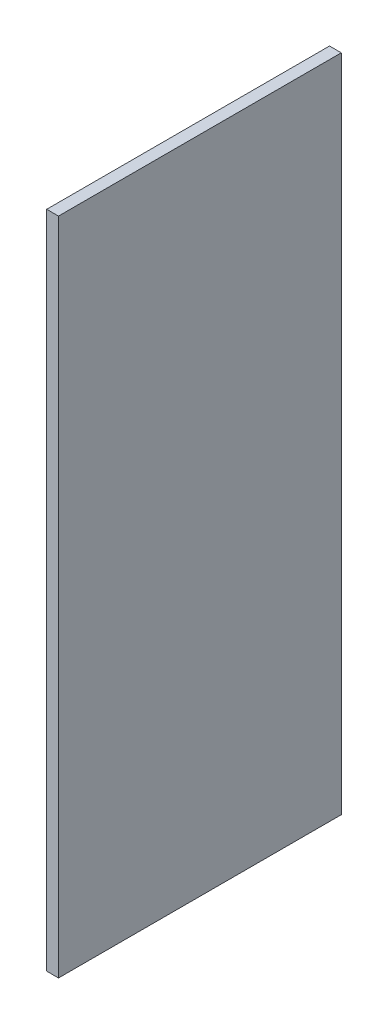
ISO-10303-21;
HEADER;
FILE_DESCRIPTION(('STEP AP214'),'2;1');
FILE_NAME('part.step','',(''),(''),'','','');
FILE_SCHEMA(('AUTOMOTIVE_DESIGN { 1 0 10303 214 1 1 1 1 }'));
ENDSEC;
DATA;
#1=APPLICATION_CONTEXT('core data for automotive mechanical design processes');
#2=APPLICATION_PROTOCOL_DEFINITION('international standard','automotive_design',2000,#1);
#3=PRODUCT_CONTEXT('',#1,'mechanical');
#4=PRODUCT('Part','Part','',(#3));
#5=PRODUCT_RELATED_PRODUCT_CATEGORY('part','',(#4));
#6=PRODUCT_DEFINITION_FORMATION('','',#4);
#7=PRODUCT_DEFINITION_CONTEXT('part definition',#1,'design');
#8=PRODUCT_DEFINITION('design','',#6,#7);
#9=PRODUCT_DEFINITION_SHAPE('','',#8);
#10=(LENGTH_UNIT() NAMED_UNIT(*) SI_UNIT(.MILLI.,.METRE.));
#11=(NAMED_UNIT(*) PLANE_ANGLE_UNIT() SI_UNIT($,.RADIAN.));
#12=(NAMED_UNIT(*) SI_UNIT($,.STERADIAN.) SOLID_ANGLE_UNIT());
#13=UNCERTAINTY_MEASURE_WITH_UNIT(LENGTH_MEASURE(1.E-05),#10,'distance_accuracy_value','');
#14=(GEOMETRIC_REPRESENTATION_CONTEXT(3) GLOBAL_UNCERTAINTY_ASSIGNED_CONTEXT((#13)) GLOBAL_UNIT_ASSIGNED_CONTEXT((#10,
#11,#12)) REPRESENTATION_CONTEXT('',''));
#15=CARTESIAN_POINT('',(0.,0.,0.));
#16=DIRECTION('',(0.,0.,1.));
#17=DIRECTION('',(1.,0.,0.));
#18=AXIS2_PLACEMENT_3D('',#15,#16,#17);
#19=CARTESIAN_POINT('',(5.,140.,-60.));
#20=DIRECTION('',(0.,0.,1.));
#21=DIRECTION('',(1.,0.,0.));
#22=AXIS2_PLACEMENT_3D('',#19,#20,#21);
#23=PLANE('',#22);
#24=DIRECTION('',(0.,1.,0.));
#25=VECTOR('',#24,1.);
#26=CARTESIAN_POINT('',(0.,140.,-60.));
#27=LINE('',#26,#25);
#28=CARTESIAN_POINT('',(0.,-140.,-60.));
#29=VERTEX_POINT('',#28);
#30=CARTESIAN_POINT('',(0.,140.,-60.));
#31=VERTEX_POINT('',#30);
#32=EDGE_CURVE('E96',#29,#31,#27,.T.);
#33=ORIENTED_EDGE('',*,*,#32,.T.);
#34=DIRECTION('',(-1.,0.,0.));
#35=VECTOR('',#34,1.);
#36=CARTESIAN_POINT('',(5.,140.,-60.));
#37=LINE('',#36,#35);
#38=CARTESIAN_POINT('',(5.,140.,-60.));
#39=VERTEX_POINT('',#38);
#40=EDGE_CURVE('E11',#39,#31,#37,.T.);
#41=ORIENTED_EDGE('',*,*,#40,.F.);
#42=DIRECTION('',(0.,1.,0.));
#43=VECTOR('',#42,1.);
#44=CARTESIAN_POINT('',(5.,140.,-60.));
#45=LINE('',#44,#43);
#46=CARTESIAN_POINT('',(5.,-140.,-60.));
#47=VERTEX_POINT('',#46);
#48=EDGE_CURVE('E84',#47,#39,#45,.T.);
#49=ORIENTED_EDGE('',*,*,#48,.F.);
#50=DIRECTION('',(-1.,0.,0.));
#51=VECTOR('',#50,1.);
#52=CARTESIAN_POINT('',(5.,-140.,-60.));
#53=LINE('',#52,#51);
#54=EDGE_CURVE('E92',#47,#29,#53,.T.);
#55=ORIENTED_EDGE('',*,*,#54,.T.);
#56=EDGE_LOOP('',(#33,#41,#49,#55));
#57=FACE_BOUND('',#56,.T.);
#58=ADVANCED_FACE('F33',(#57),#23,.F.);
#59=CARTESIAN_POINT('',(5.,140.,60.));
#60=DIRECTION('',(0.,-1.,0.));
#61=DIRECTION('',(0.,0.,-1.));
#62=AXIS2_PLACEMENT_3D('',#59,#60,#61);
#63=PLANE('',#62);
#64=DIRECTION('',(0.,0.,1.));
#65=VECTOR('',#64,1.);
#66=CARTESIAN_POINT('',(0.,140.,60.));
#67=LINE('',#66,#65);
#68=CARTESIAN_POINT('',(0.,140.,60.));
#69=VERTEX_POINT('',#68);
#70=EDGE_CURVE('E88',#31,#69,#67,.T.);
#71=ORIENTED_EDGE('',*,*,#70,.T.);
#72=DIRECTION('',(-1.,0.,0.));
#73=VECTOR('',#72,1.);
#74=CARTESIAN_POINT('',(5.,140.,60.));
#75=LINE('',#74,#73);
#76=CARTESIAN_POINT('',(5.,140.,60.));
#77=VERTEX_POINT('',#76);
#78=EDGE_CURVE('E41',#77,#69,#75,.T.);
#79=ORIENTED_EDGE('',*,*,#78,.F.);
#80=DIRECTION('',(0.,0.,1.));
#81=VECTOR('',#80,1.);
#82=CARTESIAN_POINT('',(5.,140.,60.));
#83=LINE('',#82,#81);
#84=EDGE_CURVE('E79',#39,#77,#83,.T.);
#85=ORIENTED_EDGE('',*,*,#84,.F.);
#86=ORIENTED_EDGE('',*,*,#40,.T.);
#87=EDGE_LOOP('',(#71,#79,#85,#86));
#88=FACE_BOUND('',#87,.T.);
#89=ADVANCED_FACE('F87',(#88),#63,.F.);
#90=CARTESIAN_POINT('',(5.,140.,60.));
#91=DIRECTION('',(0.,0.,-1.));
#92=DIRECTION('',(-1.,0.,0.));
#93=AXIS2_PLACEMENT_3D('',#90,#91,#92);
#94=PLANE('',#93);
#95=DIRECTION('',(0.,-1.,0.));
#96=VECTOR('',#95,1.);
#97=CARTESIAN_POINT('',(0.,140.,60.));
#98=LINE('',#97,#96);
#99=CARTESIAN_POINT('',(0.,-140.,60.));
#100=VERTEX_POINT('',#99);
#101=EDGE_CURVE('E66',#69,#100,#98,.T.);
#102=ORIENTED_EDGE('',*,*,#101,.T.);
#103=DIRECTION('',(-1.,0.,0.));
#104=VECTOR('',#103,1.);
#105=CARTESIAN_POINT('',(5.,-140.,60.));
#106=LINE('',#105,#104);
#107=CARTESIAN_POINT('',(5.,-140.,60.));
#108=VERTEX_POINT('',#107);
#109=EDGE_CURVE('E89',#108,#100,#106,.T.);
#110=ORIENTED_EDGE('',*,*,#109,.F.);
#111=DIRECTION('',(0.,-1.,0.));
#112=VECTOR('',#111,1.);
#113=CARTESIAN_POINT('',(5.,140.,60.));
#114=LINE('',#113,#112);
#115=EDGE_CURVE('E82',#77,#108,#114,.T.);
#116=ORIENTED_EDGE('',*,*,#115,.F.);
#117=ORIENTED_EDGE('',*,*,#78,.T.);
#118=EDGE_LOOP('',(#102,#110,#116,#117));
#119=FACE_BOUND('',#118,.T.);
#120=ADVANCED_FACE('F90',(#119),#94,.F.);
#121=CARTESIAN_POINT('',(5.,-140.,60.));
#122=DIRECTION('',(0.,1.,0.));
#123=DIRECTION('',(0.,0.,1.));
#124=AXIS2_PLACEMENT_3D('',#121,#122,#123);
#125=PLANE('',#124);
#126=DIRECTION('',(0.,0.,-1.));
#127=VECTOR('',#126,1.);
#128=CARTESIAN_POINT('',(0.,-140.,60.));
#129=LINE('',#128,#127);
#130=EDGE_CURVE('E72',#100,#29,#129,.T.);
#131=ORIENTED_EDGE('',*,*,#130,.T.);
#132=ORIENTED_EDGE('',*,*,#54,.F.);
#133=DIRECTION('',(0.,0.,-1.));
#134=VECTOR('',#133,1.);
#135=CARTESIAN_POINT('',(5.,-140.,60.));
#136=LINE('',#135,#134);
#137=EDGE_CURVE('E49',#108,#47,#136,.T.);
#138=ORIENTED_EDGE('',*,*,#137,.F.);
#139=ORIENTED_EDGE('',*,*,#109,.T.);
#140=EDGE_LOOP('',(#131,#132,#138,#139));
#141=FACE_BOUND('',#140,.T.);
#142=ADVANCED_FACE('F103',(#141),#125,.F.);
#143=CARTESIAN_POINT('',(5.,0.,0.));
#144=DIRECTION('',(1.,0.,0.));
#145=DIRECTION('',(0.,0.,-1.));
#146=AXIS2_PLACEMENT_3D('',#143,#144,#145);
#147=PLANE('',#146);
#148=ORIENTED_EDGE('',*,*,#48,.T.);
#149=ORIENTED_EDGE('',*,*,#84,.T.);
#150=ORIENTED_EDGE('',*,*,#115,.T.);
#151=ORIENTED_EDGE('',*,*,#137,.T.);
#152=EDGE_LOOP('',(#148,#149,#150,#151));
#153=FACE_BOUND('',#152,.T.);
#154=ADVANCED_FACE('F80',(#153),#147,.T.);
#155=CARTESIAN_POINT('',(0.,0.,0.));
#156=DIRECTION('',(1.,0.,0.));
#157=DIRECTION('',(0.,0.,-1.));
#158=AXIS2_PLACEMENT_3D('',#155,#156,#157);
#159=PLANE('',#158);
#160=ORIENTED_EDGE('',*,*,#32,.F.);
#161=ORIENTED_EDGE('',*,*,#130,.F.);
#162=ORIENTED_EDGE('',*,*,#101,.F.);
#163=ORIENTED_EDGE('',*,*,#70,.F.);
#164=EDGE_LOOP('',(#160,#161,#162,#163));
#165=FACE_BOUND('',#164,.T.);
#166=ADVANCED_FACE('F106',(#165),#159,.F.);
#167=CLOSED_SHELL('',(#58,#89,#120,#142,#154,#166));
#168=MANIFOLD_SOLID_BREP('B2',#167);
#169=ADVANCED_BREP_SHAPE_REPRESENTATION('',(#18,#168),#14);
#170=SHAPE_DEFINITION_REPRESENTATION(#9,#169);
ENDSEC;
END-ISO-10303-21;
